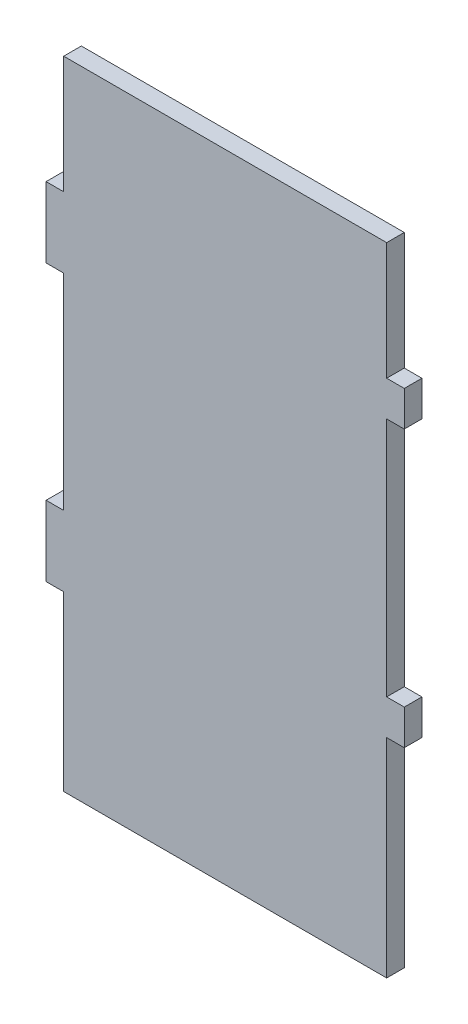
ISO-10303-21;
HEADER;
FILE_DESCRIPTION(('STEP AP214'),'2;1');
FILE_NAME('part.step','',(''),(''),'','','');
FILE_SCHEMA(('AUTOMOTIVE_DESIGN { 1 0 10303 214 1 1 1 1 }'));
ENDSEC;
DATA;
#1=APPLICATION_CONTEXT('core data for automotive mechanical design processes');
#2=APPLICATION_PROTOCOL_DEFINITION('international standard','automotive_design',2000,#1);
#3=PRODUCT_CONTEXT('',#1,'mechanical');
#4=PRODUCT('Part','Part','',(#3));
#5=PRODUCT_RELATED_PRODUCT_CATEGORY('part','',(#4));
#6=PRODUCT_DEFINITION_FORMATION('','',#4);
#7=PRODUCT_DEFINITION_CONTEXT('part definition',#1,'design');
#8=PRODUCT_DEFINITION('design','',#6,#7);
#9=PRODUCT_DEFINITION_SHAPE('','',#8);
#10=(LENGTH_UNIT() NAMED_UNIT(*) SI_UNIT(.MILLI.,.METRE.));
#11=(NAMED_UNIT(*) PLANE_ANGLE_UNIT() SI_UNIT($,.RADIAN.));
#12=(NAMED_UNIT(*) SI_UNIT($,.STERADIAN.) SOLID_ANGLE_UNIT());
#13=UNCERTAINTY_MEASURE_WITH_UNIT(LENGTH_MEASURE(1.E-05),#10,'distance_accuracy_value','');
#14=(GEOMETRIC_REPRESENTATION_CONTEXT(3) GLOBAL_UNCERTAINTY_ASSIGNED_CONTEXT((#13)) GLOBAL_UNIT_ASSIGNED_CONTEXT((#10,
#11,#12)) REPRESENTATION_CONTEXT('',''));
#15=CARTESIAN_POINT('',(0.,0.,0.));
#16=DIRECTION('',(0.,0.,1.));
#17=DIRECTION('',(1.,0.,0.));
#18=AXIS2_PLACEMENT_3D('',#15,#16,#17);
#19=CARTESIAN_POINT('',(0.,-20.,3.));
#20=DIRECTION('',(0.,-1.,0.));
#21=DIRECTION('',(0.,0.,-1.));
#22=AXIS2_PLACEMENT_3D('',#19,#20,#21);
#23=PLANE('',#22);
#24=DIRECTION('',(-1.,0.,0.));
#25=VECTOR('',#24,1.);
#26=CARTESIAN_POINT('',(0.,-20.,0.));
#27=LINE('',#26,#25);
#28=CARTESIAN_POINT('',(0.,-20.,0.));
#29=VERTEX_POINT('',#28);
#30=CARTESIAN_POINT('',(-3.,-20.,0.));
#31=VERTEX_POINT('',#30);
#32=EDGE_CURVE('E207',#29,#31,#27,.T.);
#33=ORIENTED_EDGE('',*,*,#32,.T.);
#34=DIRECTION('',(0.,0.,-1.));
#35=VECTOR('',#34,1.);
#36=CARTESIAN_POINT('',(-3.,-20.,3.));
#37=LINE('',#36,#35);
#38=CARTESIAN_POINT('',(-3.,-20.,3.));
#39=VERTEX_POINT('',#38);
#40=EDGE_CURVE('E11',#39,#31,#37,.T.);
#41=ORIENTED_EDGE('',*,*,#40,.F.);
#42=DIRECTION('',(-1.,0.,0.));
#43=VECTOR('',#42,1.);
#44=CARTESIAN_POINT('',(0.,-20.,3.));
#45=LINE('',#44,#43);
#46=CARTESIAN_POINT('',(0.,-20.,3.));
#47=VERTEX_POINT('',#46);
#48=EDGE_CURVE('E245',#47,#39,#45,.T.);
#49=ORIENTED_EDGE('',*,*,#48,.F.);
#50=DIRECTION('',(0.,0.,-1.));
#51=VECTOR('',#50,1.);
#52=CARTESIAN_POINT('',(0.,-20.,3.));
#53=LINE('',#52,#51);
#54=EDGE_CURVE('E203',#47,#29,#53,.T.);
#55=ORIENTED_EDGE('',*,*,#54,.T.);
#56=EDGE_LOOP('',(#33,#41,#49,#55));
#57=FACE_BOUND('',#56,.T.);
#58=ADVANCED_FACE('F39',(#57),#23,.F.);
#59=CARTESIAN_POINT('',(-3.,-20.,3.));
#60=DIRECTION('',(1.,0.,0.));
#61=DIRECTION('',(0.,1.,0.));
#62=AXIS2_PLACEMENT_3D('',#59,#60,#61);
#63=PLANE('',#62);
#64=DIRECTION('',(0.,-1.,0.));
#65=VECTOR('',#64,1.);
#66=CARTESIAN_POINT('',(-3.,-20.,0.));
#67=LINE('',#66,#65);
#68=CARTESIAN_POINT('',(-3.,-32.,0.));
#69=VERTEX_POINT('',#68);
#70=EDGE_CURVE('E210',#31,#69,#67,.T.);
#71=ORIENTED_EDGE('',*,*,#70,.T.);
#72=DIRECTION('',(0.,0.,-1.));
#73=VECTOR('',#72,1.);
#74=CARTESIAN_POINT('',(-3.,-32.,3.));
#75=LINE('',#74,#73);
#76=CARTESIAN_POINT('',(-3.,-32.,3.));
#77=VERTEX_POINT('',#76);
#78=EDGE_CURVE('E47',#77,#69,#75,.T.);
#79=ORIENTED_EDGE('',*,*,#78,.F.);
#80=DIRECTION('',(0.,-1.,0.));
#81=VECTOR('',#80,1.);
#82=CARTESIAN_POINT('',(-3.,-20.,3.));
#83=LINE('',#82,#81);
#84=EDGE_CURVE('E134',#39,#77,#83,.T.);
#85=ORIENTED_EDGE('',*,*,#84,.F.);
#86=ORIENTED_EDGE('',*,*,#40,.T.);
#87=EDGE_LOOP('',(#71,#79,#85,#86));
#88=FACE_BOUND('',#87,.T.);
#89=ADVANCED_FACE('F363',(#88),#63,.F.);
#90=CARTESIAN_POINT('',(0.,-32.,3.));
#91=DIRECTION('',(0.,1.,0.));
#92=DIRECTION('',(0.,0.,1.));
#93=AXIS2_PLACEMENT_3D('',#90,#91,#92);
#94=PLANE('',#93);
#95=DIRECTION('',(1.,0.,0.));
#96=VECTOR('',#95,1.);
#97=CARTESIAN_POINT('',(0.,-32.,0.));
#98=LINE('',#97,#96);
#99=CARTESIAN_POINT('',(0.,-32.,0.));
#100=VERTEX_POINT('',#99);
#101=EDGE_CURVE('E212',#69,#100,#98,.T.);
#102=ORIENTED_EDGE('',*,*,#101,.T.);
#103=DIRECTION('',(0.,0.,-1.));
#104=VECTOR('',#103,1.);
#105=CARTESIAN_POINT('',(0.,-32.,3.));
#106=LINE('',#105,#104);
#107=CARTESIAN_POINT('',(0.,-32.,3.));
#108=VERTEX_POINT('',#107);
#109=EDGE_CURVE('E288',#108,#100,#106,.T.);
#110=ORIENTED_EDGE('',*,*,#109,.F.);
#111=DIRECTION('',(1.,0.,0.));
#112=VECTOR('',#111,1.);
#113=CARTESIAN_POINT('',(0.,-32.,3.));
#114=LINE('',#113,#112);
#115=EDGE_CURVE('E296',#77,#108,#114,.T.);
#116=ORIENTED_EDGE('',*,*,#115,.F.);
#117=ORIENTED_EDGE('',*,*,#78,.T.);
#118=EDGE_LOOP('',(#102,#110,#116,#117));
#119=FACE_BOUND('',#118,.T.);
#120=ADVANCED_FACE('F294',(#119),#94,.F.);
#121=CARTESIAN_POINT('',(0.,-32.,3.));
#122=DIRECTION('',(1.,0.,0.));
#123=DIRECTION('',(0.,1.,0.));
#124=AXIS2_PLACEMENT_3D('',#121,#122,#123);
#125=PLANE('',#124);
#126=DIRECTION('',(0.,-1.,0.));
#127=VECTOR('',#126,1.);
#128=CARTESIAN_POINT('',(0.,-32.,0.));
#129=LINE('',#128,#127);
#130=CARTESIAN_POINT('',(0.,-67.,0.));
#131=VERTEX_POINT('',#130);
#132=EDGE_CURVE('E214',#100,#131,#129,.T.);
#133=ORIENTED_EDGE('',*,*,#132,.T.);
#134=DIRECTION('',(0.,0.,-1.));
#135=VECTOR('',#134,1.);
#136=CARTESIAN_POINT('',(0.,-67.,3.));
#137=LINE('',#136,#135);
#138=CARTESIAN_POINT('',(0.,-67.,3.));
#139=VERTEX_POINT('',#138);
#140=EDGE_CURVE('E285',#139,#131,#137,.T.);
#141=ORIENTED_EDGE('',*,*,#140,.F.);
#142=DIRECTION('',(0.,-1.,0.));
#143=VECTOR('',#142,1.);
#144=CARTESIAN_POINT('',(0.,-32.,3.));
#145=LINE('',#144,#143);
#146=EDGE_CURVE('E314',#108,#139,#145,.T.);
#147=ORIENTED_EDGE('',*,*,#146,.F.);
#148=ORIENTED_EDGE('',*,*,#109,.T.);
#149=EDGE_LOOP('',(#133,#141,#147,#148));
#150=FACE_BOUND('',#149,.T.);
#151=ADVANCED_FACE('F305',(#150),#125,.F.);
#152=CARTESIAN_POINT('',(0.,-67.,3.));
#153=DIRECTION('',(0.,-1.,0.));
#154=DIRECTION('',(0.,0.,-1.));
#155=AXIS2_PLACEMENT_3D('',#152,#153,#154);
#156=PLANE('',#155);
#157=DIRECTION('',(-1.,0.,0.));
#158=VECTOR('',#157,1.);
#159=CARTESIAN_POINT('',(0.,-67.,0.));
#160=LINE('',#159,#158);
#161=CARTESIAN_POINT('',(-3.,-67.,0.));
#162=VERTEX_POINT('',#161);
#163=EDGE_CURVE('E216',#131,#162,#160,.T.);
#164=ORIENTED_EDGE('',*,*,#163,.T.);
#165=DIRECTION('',(0.,0.,-1.));
#166=VECTOR('',#165,1.);
#167=CARTESIAN_POINT('',(-3.,-67.,3.));
#168=LINE('',#167,#166);
#169=CARTESIAN_POINT('',(-3.,-67.,3.));
#170=VERTEX_POINT('',#169);
#171=EDGE_CURVE('E282',#170,#162,#168,.T.);
#172=ORIENTED_EDGE('',*,*,#171,.F.);
#173=DIRECTION('',(-1.,0.,0.));
#174=VECTOR('',#173,1.);
#175=CARTESIAN_POINT('',(0.,-67.,3.));
#176=LINE('',#175,#174);
#177=EDGE_CURVE('E311',#139,#170,#176,.T.);
#178=ORIENTED_EDGE('',*,*,#177,.F.);
#179=ORIENTED_EDGE('',*,*,#140,.T.);
#180=EDGE_LOOP('',(#164,#172,#178,#179));
#181=FACE_BOUND('',#180,.T.);
#182=ADVANCED_FACE('F309',(#181),#156,.F.);
#183=CARTESIAN_POINT('',(-3.,-67.,3.));
#184=DIRECTION('',(1.,0.,0.));
#185=DIRECTION('',(0.,1.,0.));
#186=AXIS2_PLACEMENT_3D('',#183,#184,#185);
#187=PLANE('',#186);
#188=DIRECTION('',(0.,-1.,0.));
#189=VECTOR('',#188,1.);
#190=CARTESIAN_POINT('',(-3.,-67.,0.));
#191=LINE('',#190,#189);
#192=CARTESIAN_POINT('',(-2.99999999999999,-79.,0.));
#193=VERTEX_POINT('',#192);
#194=EDGE_CURVE('E218',#162,#193,#191,.T.);
#195=ORIENTED_EDGE('',*,*,#194,.T.);
#196=DIRECTION('',(0.,0.,-1.));
#197=VECTOR('',#196,1.);
#198=CARTESIAN_POINT('',(-2.99999999999999,-79.,3.));
#199=LINE('',#198,#197);
#200=CARTESIAN_POINT('',(-2.99999999999999,-79.,3.));
#201=VERTEX_POINT('',#200);
#202=EDGE_CURVE('E279',#201,#193,#199,.T.);
#203=ORIENTED_EDGE('',*,*,#202,.F.);
#204=DIRECTION('',(0.,-1.,0.));
#205=VECTOR('',#204,1.);
#206=CARTESIAN_POINT('',(-3.,-67.,3.));
#207=LINE('',#206,#205);
#208=EDGE_CURVE('E313',#170,#201,#207,.T.);
#209=ORIENTED_EDGE('',*,*,#208,.F.);
#210=ORIENTED_EDGE('',*,*,#171,.T.);
#211=EDGE_LOOP('',(#195,#203,#209,#210));
#212=FACE_BOUND('',#211,.T.);
#213=ADVANCED_FACE('F376',(#212),#187,.F.);
#214=CARTESIAN_POINT('',(0.,-79.,3.));
#215=DIRECTION('',(0.,1.,0.));
#216=DIRECTION('',(0.,0.,1.));
#217=AXIS2_PLACEMENT_3D('',#214,#215,#216);
#218=PLANE('',#217);
#219=DIRECTION('',(1.,0.,0.));
#220=VECTOR('',#219,1.);
#221=CARTESIAN_POINT('',(0.,-79.,0.));
#222=LINE('',#221,#220);
#223=CARTESIAN_POINT('',(0.,-79.,0.));
#224=VERTEX_POINT('',#223);
#225=EDGE_CURVE('E220',#193,#224,#222,.T.);
#226=ORIENTED_EDGE('',*,*,#225,.T.);
#227=DIRECTION('',(0.,0.,-1.));
#228=VECTOR('',#227,1.);
#229=CARTESIAN_POINT('',(0.,-79.,3.));
#230=LINE('',#229,#228);
#231=CARTESIAN_POINT('',(0.,-79.,3.));
#232=VERTEX_POINT('',#231);
#233=EDGE_CURVE('E276',#232,#224,#230,.T.);
#234=ORIENTED_EDGE('',*,*,#233,.F.);
#235=DIRECTION('',(1.,0.,0.));
#236=VECTOR('',#235,1.);
#237=CARTESIAN_POINT('',(0.,-79.,3.));
#238=LINE('',#237,#236);
#239=EDGE_CURVE('E316',#201,#232,#238,.T.);
#240=ORIENTED_EDGE('',*,*,#239,.F.);
#241=ORIENTED_EDGE('',*,*,#202,.T.);
#242=EDGE_LOOP('',(#226,#234,#240,#241));
#243=FACE_BOUND('',#242,.T.);
#244=ADVANCED_FACE('F379',(#243),#218,.F.);
#245=CARTESIAN_POINT('',(0.,-79.,3.));
#246=DIRECTION('',(1.,0.,0.));
#247=DIRECTION('',(0.,1.,0.));
#248=AXIS2_PLACEMENT_3D('',#245,#246,#247);
#249=PLANE('',#248);
#250=DIRECTION('',(0.,-1.,0.));
#251=VECTOR('',#250,1.);
#252=CARTESIAN_POINT('',(0.,-79.,0.));
#253=LINE('',#252,#251);
#254=CARTESIAN_POINT('',(0.,-108.46,0.));
#255=VERTEX_POINT('',#254);
#256=EDGE_CURVE('E222',#224,#255,#253,.T.);
#257=ORIENTED_EDGE('',*,*,#256,.T.);
#258=DIRECTION('',(0.,0.,-1.));
#259=VECTOR('',#258,1.);
#260=CARTESIAN_POINT('',(0.,-108.46,3.));
#261=LINE('',#260,#259);
#262=CARTESIAN_POINT('',(0.,-108.46,3.));
#263=VERTEX_POINT('',#262);
#264=EDGE_CURVE('E273',#263,#255,#261,.T.);
#265=ORIENTED_EDGE('',*,*,#264,.F.);
#266=DIRECTION('',(0.,-1.,0.));
#267=VECTOR('',#266,1.);
#268=CARTESIAN_POINT('',(0.,-79.,3.));
#269=LINE('',#268,#267);
#270=EDGE_CURVE('E322',#232,#263,#269,.T.);
#271=ORIENTED_EDGE('',*,*,#270,.F.);
#272=ORIENTED_EDGE('',*,*,#233,.T.);
#273=EDGE_LOOP('',(#257,#265,#271,#272));
#274=FACE_BOUND('',#273,.T.);
#275=ADVANCED_FACE('F383',(#274),#249,.F.);
#276=CARTESIAN_POINT('',(0.,-108.46,3.));
#277=DIRECTION('',(0.,1.,0.));
#278=DIRECTION('',(0.,0.,1.));
#279=AXIS2_PLACEMENT_3D('',#276,#277,#278);
#280=PLANE('',#279);
#281=DIRECTION('',(1.,0.,0.));
#282=VECTOR('',#281,1.);
#283=CARTESIAN_POINT('',(0.,-108.46,0.));
#284=LINE('',#283,#282);
#285=CARTESIAN_POINT('',(55.,-108.46,0.));
#286=VERTEX_POINT('',#285);
#287=EDGE_CURVE('E224',#255,#286,#284,.T.);
#288=ORIENTED_EDGE('',*,*,#287,.T.);
#289=DIRECTION('',(0.,0.,-1.));
#290=VECTOR('',#289,1.);
#291=CARTESIAN_POINT('',(55.,-108.46,3.));
#292=LINE('',#291,#290);
#293=CARTESIAN_POINT('',(55.,-108.46,3.));
#294=VERTEX_POINT('',#293);
#295=EDGE_CURVE('E270',#294,#286,#292,.T.);
#296=ORIENTED_EDGE('',*,*,#295,.F.);
#297=DIRECTION('',(1.,0.,0.));
#298=VECTOR('',#297,1.);
#299=CARTESIAN_POINT('',(0.,-108.46,3.));
#300=LINE('',#299,#298);
#301=EDGE_CURVE('E324',#263,#294,#300,.T.);
#302=ORIENTED_EDGE('',*,*,#301,.F.);
#303=ORIENTED_EDGE('',*,*,#264,.T.);
#304=EDGE_LOOP('',(#288,#296,#302,#303));
#305=FACE_BOUND('',#304,.T.);
#306=ADVANCED_FACE('F387',(#305),#280,.F.);
#307=CARTESIAN_POINT('',(55.,-73.,3.));
#308=DIRECTION('',(-1.,0.,0.));
#309=DIRECTION('',(0.,-1.,0.));
#310=AXIS2_PLACEMENT_3D('',#307,#308,#309);
#311=PLANE('',#310);
#312=DIRECTION('',(0.,1.,0.));
#313=VECTOR('',#312,1.);
#314=CARTESIAN_POINT('',(55.,-73.,0.));
#315=LINE('',#314,#313);
#316=CARTESIAN_POINT('',(55.,-73.,0.));
#317=VERTEX_POINT('',#316);
#318=EDGE_CURVE('E226',#286,#317,#315,.T.);
#319=ORIENTED_EDGE('',*,*,#318,.T.);
#320=DIRECTION('',(0.,0.,-1.));
#321=VECTOR('',#320,1.);
#322=CARTESIAN_POINT('',(55.,-73.,3.));
#323=LINE('',#322,#321);
#324=CARTESIAN_POINT('',(55.,-73.,3.));
#325=VERTEX_POINT('',#324);
#326=EDGE_CURVE('E267',#325,#317,#323,.T.);
#327=ORIENTED_EDGE('',*,*,#326,.F.);
#328=DIRECTION('',(0.,1.,0.));
#329=VECTOR('',#328,1.);
#330=CARTESIAN_POINT('',(55.,-73.,3.));
#331=LINE('',#330,#329);
#332=EDGE_CURVE('E326',#294,#325,#331,.T.);
#333=ORIENTED_EDGE('',*,*,#332,.F.);
#334=ORIENTED_EDGE('',*,*,#295,.T.);
#335=EDGE_LOOP('',(#319,#327,#333,#334));
#336=FACE_BOUND('',#335,.T.);
#337=ADVANCED_FACE('F391',(#336),#311,.F.);
#338=CARTESIAN_POINT('',(55.,-73.,3.));
#339=DIRECTION('',(0.,1.,0.));
#340=DIRECTION('',(0.,0.,1.));
#341=AXIS2_PLACEMENT_3D('',#338,#339,#340);
#342=PLANE('',#341);
#343=DIRECTION('',(1.,0.,0.));
#344=VECTOR('',#343,1.);
#345=CARTESIAN_POINT('',(55.,-73.,0.));
#346=LINE('',#345,#344);
#347=CARTESIAN_POINT('',(58.,-73.,0.));
#348=VERTEX_POINT('',#347);
#349=EDGE_CURVE('E228',#317,#348,#346,.T.);
#350=ORIENTED_EDGE('',*,*,#349,.T.);
#351=DIRECTION('',(0.,0.,-1.));
#352=VECTOR('',#351,1.);
#353=CARTESIAN_POINT('',(58.,-73.,3.));
#354=LINE('',#353,#352);
#355=CARTESIAN_POINT('',(58.,-73.,3.));
#356=VERTEX_POINT('',#355);
#357=EDGE_CURVE('E264',#356,#348,#354,.T.);
#358=ORIENTED_EDGE('',*,*,#357,.F.);
#359=DIRECTION('',(1.,0.,0.));
#360=VECTOR('',#359,1.);
#361=CARTESIAN_POINT('',(55.,-73.,3.));
#362=LINE('',#361,#360);
#363=EDGE_CURVE('E328',#325,#356,#362,.T.);
#364=ORIENTED_EDGE('',*,*,#363,.F.);
#365=ORIENTED_EDGE('',*,*,#326,.T.);
#366=EDGE_LOOP('',(#350,#358,#364,#365));
#367=FACE_BOUND('',#366,.T.);
#368=ADVANCED_FACE('F395',(#367),#342,.F.);
#369=CARTESIAN_POINT('',(58.,-67.,3.));
#370=DIRECTION('',(-1.,0.,0.));
#371=DIRECTION('',(0.,0.,1.));
#372=AXIS2_PLACEMENT_3D('',#369,#370,#371);
#373=PLANE('',#372);
#374=DIRECTION('',(0.,1.,0.));
#375=VECTOR('',#374,1.);
#376=CARTESIAN_POINT('',(58.,-67.,0.));
#377=LINE('',#376,#375);
#378=CARTESIAN_POINT('',(58.,-67.,0.));
#379=VERTEX_POINT('',#378);
#380=EDGE_CURVE('E230',#348,#379,#377,.T.);
#381=ORIENTED_EDGE('',*,*,#380,.T.);
#382=DIRECTION('',(0.,0.,-1.));
#383=VECTOR('',#382,1.);
#384=CARTESIAN_POINT('',(58.,-67.,3.));
#385=LINE('',#384,#383);
#386=CARTESIAN_POINT('',(58.,-67.,3.));
#387=VERTEX_POINT('',#386);
#388=EDGE_CURVE('E261',#387,#379,#385,.T.);
#389=ORIENTED_EDGE('',*,*,#388,.F.);
#390=DIRECTION('',(0.,1.,0.));
#391=VECTOR('',#390,1.);
#392=CARTESIAN_POINT('',(58.,-67.,3.));
#393=LINE('',#392,#391);
#394=EDGE_CURVE('E330',#356,#387,#393,.T.);
#395=ORIENTED_EDGE('',*,*,#394,.F.);
#396=ORIENTED_EDGE('',*,*,#357,.T.);
#397=EDGE_LOOP('',(#381,#389,#395,#396));
#398=FACE_BOUND('',#397,.T.);
#399=ADVANCED_FACE('F399',(#398),#373,.F.);
#400=CARTESIAN_POINT('',(55.,-67.,3.));
#401=DIRECTION('',(0.,-1.,0.));
#402=DIRECTION('',(0.,0.,-1.));
#403=AXIS2_PLACEMENT_3D('',#400,#401,#402);
#404=PLANE('',#403);
#405=DIRECTION('',(-1.,0.,0.));
#406=VECTOR('',#405,1.);
#407=CARTESIAN_POINT('',(55.,-67.,0.));
#408=LINE('',#407,#406);
#409=CARTESIAN_POINT('',(55.,-67.,0.));
#410=VERTEX_POINT('',#409);
#411=EDGE_CURVE('E232',#379,#410,#408,.T.);
#412=ORIENTED_EDGE('',*,*,#411,.T.);
#413=DIRECTION('',(0.,0.,-1.));
#414=VECTOR('',#413,1.);
#415=CARTESIAN_POINT('',(55.,-67.,3.));
#416=LINE('',#415,#414);
#417=CARTESIAN_POINT('',(55.,-67.,3.));
#418=VERTEX_POINT('',#417);
#419=EDGE_CURVE('E258',#418,#410,#416,.T.);
#420=ORIENTED_EDGE('',*,*,#419,.F.);
#421=DIRECTION('',(-1.,0.,0.));
#422=VECTOR('',#421,1.);
#423=CARTESIAN_POINT('',(55.,-67.,3.));
#424=LINE('',#423,#422);
#425=EDGE_CURVE('E332',#387,#418,#424,.T.);
#426=ORIENTED_EDGE('',*,*,#425,.F.);
#427=ORIENTED_EDGE('',*,*,#388,.T.);
#428=EDGE_LOOP('',(#412,#420,#426,#427));
#429=FACE_BOUND('',#428,.T.);
#430=ADVANCED_FACE('F403',(#429),#404,.F.);
#431=CARTESIAN_POINT('',(55.,-26.,3.));
#432=DIRECTION('',(-1.,0.,0.));
#433=DIRECTION('',(0.,-1.,0.));
#434=AXIS2_PLACEMENT_3D('',#431,#432,#433);
#435=PLANE('',#434);
#436=DIRECTION('',(0.,1.,0.));
#437=VECTOR('',#436,1.);
#438=CARTESIAN_POINT('',(55.,-26.,0.));
#439=LINE('',#438,#437);
#440=CARTESIAN_POINT('',(55.,-26.,0.));
#441=VERTEX_POINT('',#440);
#442=EDGE_CURVE('E234',#410,#441,#439,.T.);
#443=ORIENTED_EDGE('',*,*,#442,.T.);
#444=DIRECTION('',(0.,0.,-1.));
#445=VECTOR('',#444,1.);
#446=CARTESIAN_POINT('',(55.,-26.,3.));
#447=LINE('',#446,#445);
#448=CARTESIAN_POINT('',(55.,-26.,3.));
#449=VERTEX_POINT('',#448);
#450=EDGE_CURVE('E255',#449,#441,#447,.T.);
#451=ORIENTED_EDGE('',*,*,#450,.F.);
#452=DIRECTION('',(0.,1.,0.));
#453=VECTOR('',#452,1.);
#454=CARTESIAN_POINT('',(55.,-26.,3.));
#455=LINE('',#454,#453);
#456=EDGE_CURVE('E334',#418,#449,#455,.T.);
#457=ORIENTED_EDGE('',*,*,#456,.F.);
#458=ORIENTED_EDGE('',*,*,#419,.T.);
#459=EDGE_LOOP('',(#443,#451,#457,#458));
#460=FACE_BOUND('',#459,.T.);
#461=ADVANCED_FACE('F407',(#460),#435,.F.);
#462=CARTESIAN_POINT('',(55.,-26.,3.));
#463=DIRECTION('',(0.,1.,0.));
#464=DIRECTION('',(-1.,0.,0.));
#465=AXIS2_PLACEMENT_3D('',#462,#463,#464);
#466=PLANE('',#465);
#467=DIRECTION('',(1.,0.,0.));
#468=VECTOR('',#467,1.);
#469=CARTESIAN_POINT('',(55.,-26.,0.));
#470=LINE('',#469,#468);
#471=CARTESIAN_POINT('',(58.,-26.,0.));
#472=VERTEX_POINT('',#471);
#473=EDGE_CURVE('E236',#441,#472,#470,.T.);
#474=ORIENTED_EDGE('',*,*,#473,.T.);
#475=DIRECTION('',(0.,0.,-1.));
#476=VECTOR('',#475,1.);
#477=CARTESIAN_POINT('',(58.,-26.,3.));
#478=LINE('',#477,#476);
#479=CARTESIAN_POINT('',(58.,-26.,3.));
#480=VERTEX_POINT('',#479);
#481=EDGE_CURVE('E252',#480,#472,#478,.T.);
#482=ORIENTED_EDGE('',*,*,#481,.F.);
#483=DIRECTION('',(1.,0.,0.));
#484=VECTOR('',#483,1.);
#485=CARTESIAN_POINT('',(55.,-26.,3.));
#486=LINE('',#485,#484);
#487=EDGE_CURVE('E336',#449,#480,#486,.T.);
#488=ORIENTED_EDGE('',*,*,#487,.F.);
#489=ORIENTED_EDGE('',*,*,#450,.T.);
#490=EDGE_LOOP('',(#474,#482,#488,#489));
#491=FACE_BOUND('',#490,.T.);
#492=ADVANCED_FACE('F411',(#491),#466,.F.);
#493=CARTESIAN_POINT('',(58.,-20.,3.));
#494=DIRECTION('',(-1.,0.,0.));
#495=DIRECTION('',(0.,0.,1.));
#496=AXIS2_PLACEMENT_3D('',#493,#494,#495);
#497=PLANE('',#496);
#498=DIRECTION('',(0.,1.,0.));
#499=VECTOR('',#498,1.);
#500=CARTESIAN_POINT('',(58.,-20.,0.));
#501=LINE('',#500,#499);
#502=CARTESIAN_POINT('',(58.,-20.,0.));
#503=VERTEX_POINT('',#502);
#504=EDGE_CURVE('E238',#472,#503,#501,.T.);
#505=ORIENTED_EDGE('',*,*,#504,.T.);
#506=DIRECTION('',(0.,0.,-1.));
#507=VECTOR('',#506,1.);
#508=CARTESIAN_POINT('',(58.,-20.,3.));
#509=LINE('',#508,#507);
#510=CARTESIAN_POINT('',(58.,-20.,3.));
#511=VERTEX_POINT('',#510);
#512=EDGE_CURVE('E249',#511,#503,#509,.T.);
#513=ORIENTED_EDGE('',*,*,#512,.F.);
#514=DIRECTION('',(0.,1.,0.));
#515=VECTOR('',#514,1.);
#516=CARTESIAN_POINT('',(58.,-20.,3.));
#517=LINE('',#516,#515);
#518=EDGE_CURVE('E338',#480,#511,#517,.T.);
#519=ORIENTED_EDGE('',*,*,#518,.F.);
#520=ORIENTED_EDGE('',*,*,#481,.T.);
#521=EDGE_LOOP('',(#505,#513,#519,#520));
#522=FACE_BOUND('',#521,.T.);
#523=ADVANCED_FACE('F344',(#522),#497,.F.);
#524=CARTESIAN_POINT('',(55.,-20.,3.));
#525=DIRECTION('',(0.,-1.,0.));
#526=DIRECTION('',(0.,0.,-1.));
#527=AXIS2_PLACEMENT_3D('',#524,#525,#526);
#528=PLANE('',#527);
#529=DIRECTION('',(-1.,0.,0.));
#530=VECTOR('',#529,1.);
#531=CARTESIAN_POINT('',(55.,-20.,0.));
#532=LINE('',#531,#530);
#533=CARTESIAN_POINT('',(55.,-20.,0.));
#534=VERTEX_POINT('',#533);
#535=EDGE_CURVE('E240',#503,#534,#532,.T.);
#536=ORIENTED_EDGE('',*,*,#535,.T.);
#537=DIRECTION('',(0.,0.,-1.));
#538=VECTOR('',#537,1.);
#539=CARTESIAN_POINT('',(55.,-20.,3.));
#540=LINE('',#539,#538);
#541=CARTESIAN_POINT('',(55.,-20.,3.));
#542=VERTEX_POINT('',#541);
#543=EDGE_CURVE('E198',#542,#534,#540,.T.);
#544=ORIENTED_EDGE('',*,*,#543,.F.);
#545=DIRECTION('',(-1.,0.,0.));
#546=VECTOR('',#545,1.);
#547=CARTESIAN_POINT('',(55.,-20.,3.));
#548=LINE('',#547,#546);
#549=EDGE_CURVE('E189',#511,#542,#548,.T.);
#550=ORIENTED_EDGE('',*,*,#549,.F.);
#551=ORIENTED_EDGE('',*,*,#512,.T.);
#552=EDGE_LOOP('',(#536,#544,#550,#551));
#553=FACE_BOUND('',#552,.T.);
#554=ADVANCED_FACE('F348',(#553),#528,.F.);
#555=CARTESIAN_POINT('',(55.,0.,3.));
#556=DIRECTION('',(-1.,0.,0.));
#557=DIRECTION('',(0.,0.,1.));
#558=AXIS2_PLACEMENT_3D('',#555,#556,#557);
#559=PLANE('',#558);
#560=DIRECTION('',(0.,1.,0.));
#561=VECTOR('',#560,1.);
#562=CARTESIAN_POINT('',(55.,0.,0.));
#563=LINE('',#562,#561);
#564=CARTESIAN_POINT('',(55.,0.,0.));
#565=VERTEX_POINT('',#564);
#566=EDGE_CURVE('E197',#534,#565,#563,.T.);
#567=ORIENTED_EDGE('',*,*,#566,.T.);
#568=DIRECTION('',(0.,0.,-1.));
#569=VECTOR('',#568,1.);
#570=CARTESIAN_POINT('',(55.,0.,3.));
#571=LINE('',#570,#569);
#572=CARTESIAN_POINT('',(55.,0.,3.));
#573=VERTEX_POINT('',#572);
#574=EDGE_CURVE('E194',#573,#565,#571,.T.);
#575=ORIENTED_EDGE('',*,*,#574,.F.);
#576=DIRECTION('',(0.,1.,0.));
#577=VECTOR('',#576,1.);
#578=CARTESIAN_POINT('',(55.,0.,3.));
#579=LINE('',#578,#577);
#580=EDGE_CURVE('E183',#542,#573,#579,.T.);
#581=ORIENTED_EDGE('',*,*,#580,.F.);
#582=ORIENTED_EDGE('',*,*,#543,.T.);
#583=EDGE_LOOP('',(#567,#575,#581,#582));
#584=FACE_BOUND('',#583,.T.);
#585=ADVANCED_FACE('F195',(#584),#559,.F.);
#586=CARTESIAN_POINT('',(0.,0.,3.));
#587=DIRECTION('',(0.,-1.,0.));
#588=DIRECTION('',(0.,0.,-1.));
#589=AXIS2_PLACEMENT_3D('',#586,#587,#588);
#590=PLANE('',#589);
#591=DIRECTION('',(-1.,0.,0.));
#592=VECTOR('',#591,1.);
#593=CARTESIAN_POINT('',(0.,0.,0.));
#594=LINE('',#593,#592);
#595=CARTESIAN_POINT('',(0.,0.,0.));
#596=VERTEX_POINT('',#595);
#597=EDGE_CURVE('E120',#565,#596,#594,.T.);
#598=ORIENTED_EDGE('',*,*,#597,.T.);
#599=DIRECTION('',(0.,0.,-1.));
#600=VECTOR('',#599,1.);
#601=CARTESIAN_POINT('',(0.,0.,3.));
#602=LINE('',#601,#600);
#603=CARTESIAN_POINT('',(0.,0.,3.));
#604=VERTEX_POINT('',#603);
#605=EDGE_CURVE('E199',#604,#596,#602,.T.);
#606=ORIENTED_EDGE('',*,*,#605,.F.);
#607=DIRECTION('',(-1.,0.,0.));
#608=VECTOR('',#607,1.);
#609=CARTESIAN_POINT('',(0.,0.,3.));
#610=LINE('',#609,#608);
#611=EDGE_CURVE('E187',#573,#604,#610,.T.);
#612=ORIENTED_EDGE('',*,*,#611,.F.);
#613=ORIENTED_EDGE('',*,*,#574,.T.);
#614=EDGE_LOOP('',(#598,#606,#612,#613));
#615=FACE_BOUND('',#614,.T.);
#616=ADVANCED_FACE('F201',(#615),#590,.F.);
#617=CARTESIAN_POINT('',(0.,0.,3.));
#618=DIRECTION('',(1.,0.,0.));
#619=DIRECTION('',(0.,1.,0.));
#620=AXIS2_PLACEMENT_3D('',#617,#618,#619);
#621=PLANE('',#620);
#622=DIRECTION('',(0.,-1.,0.));
#623=VECTOR('',#622,1.);
#624=CARTESIAN_POINT('',(0.,0.,0.));
#625=LINE('',#624,#623);
#626=EDGE_CURVE('E126',#596,#29,#625,.T.);
#627=ORIENTED_EDGE('',*,*,#626,.T.);
#628=ORIENTED_EDGE('',*,*,#54,.F.);
#629=DIRECTION('',(0.,-1.,0.));
#630=VECTOR('',#629,1.);
#631=CARTESIAN_POINT('',(0.,0.,3.));
#632=LINE('',#631,#630);
#633=EDGE_CURVE('E55',#604,#47,#632,.T.);
#634=ORIENTED_EDGE('',*,*,#633,.F.);
#635=ORIENTED_EDGE('',*,*,#605,.T.);
#636=EDGE_LOOP('',(#627,#628,#634,#635));
#637=FACE_BOUND('',#636,.T.);
#638=ADVANCED_FACE('F352',(#637),#621,.F.);
#639=CARTESIAN_POINT('',(0.,0.,3.));
#640=DIRECTION('',(0.,0.,1.));
#641=DIRECTION('',(1.,0.,0.));
#642=AXIS2_PLACEMENT_3D('',#639,#640,#641);
#643=PLANE('',#642);
#644=ORIENTED_EDGE('',*,*,#48,.T.);
#645=ORIENTED_EDGE('',*,*,#84,.T.);
#646=ORIENTED_EDGE('',*,*,#115,.T.);
#647=ORIENTED_EDGE('',*,*,#146,.T.);
#648=ORIENTED_EDGE('',*,*,#177,.T.);
#649=ORIENTED_EDGE('',*,*,#208,.T.);
#650=ORIENTED_EDGE('',*,*,#239,.T.);
#651=ORIENTED_EDGE('',*,*,#270,.T.);
#652=ORIENTED_EDGE('',*,*,#301,.T.);
#653=ORIENTED_EDGE('',*,*,#332,.T.);
#654=ORIENTED_EDGE('',*,*,#363,.T.);
#655=ORIENTED_EDGE('',*,*,#394,.T.);
#656=ORIENTED_EDGE('',*,*,#425,.T.);
#657=ORIENTED_EDGE('',*,*,#456,.T.);
#658=ORIENTED_EDGE('',*,*,#487,.T.);
#659=ORIENTED_EDGE('',*,*,#518,.T.);
#660=ORIENTED_EDGE('',*,*,#549,.T.);
#661=ORIENTED_EDGE('',*,*,#580,.T.);
#662=ORIENTED_EDGE('',*,*,#611,.T.);
#663=ORIENTED_EDGE('',*,*,#633,.T.);
#664=EDGE_LOOP('',(#644,#645,#646,#647,#648,#649,#650,#651,#652,#653,#654,#655,#656,#657,#658,
#659,#660,#661,#662,#663));
#665=FACE_BOUND('',#664,.T.);
#666=ADVANCED_FACE('F185',(#665),#643,.T.);
#667=CARTESIAN_POINT('',(0.,0.,0.));
#668=DIRECTION('',(0.,0.,1.));
#669=DIRECTION('',(1.,0.,0.));
#670=AXIS2_PLACEMENT_3D('',#667,#668,#669);
#671=PLANE('',#670);
#672=ORIENTED_EDGE('',*,*,#32,.F.);
#673=ORIENTED_EDGE('',*,*,#626,.F.);
#674=ORIENTED_EDGE('',*,*,#597,.F.);
#675=ORIENTED_EDGE('',*,*,#566,.F.);
#676=ORIENTED_EDGE('',*,*,#535,.F.);
#677=ORIENTED_EDGE('',*,*,#504,.F.);
#678=ORIENTED_EDGE('',*,*,#473,.F.);
#679=ORIENTED_EDGE('',*,*,#442,.F.);
#680=ORIENTED_EDGE('',*,*,#411,.F.);
#681=ORIENTED_EDGE('',*,*,#380,.F.);
#682=ORIENTED_EDGE('',*,*,#349,.F.);
#683=ORIENTED_EDGE('',*,*,#318,.F.);
#684=ORIENTED_EDGE('',*,*,#287,.F.);
#685=ORIENTED_EDGE('',*,*,#256,.F.);
#686=ORIENTED_EDGE('',*,*,#225,.F.);
#687=ORIENTED_EDGE('',*,*,#194,.F.);
#688=ORIENTED_EDGE('',*,*,#163,.F.);
#689=ORIENTED_EDGE('',*,*,#132,.F.);
#690=ORIENTED_EDGE('',*,*,#101,.F.);
#691=ORIENTED_EDGE('',*,*,#70,.F.);
#692=EDGE_LOOP('',(#672,#673,#674,#675,#676,#677,#678,#679,#680,#681,#682,#683,#684,#685,#686,
#687,#688,#689,#690,#691));
#693=FACE_BOUND('',#692,.T.);
#694=ADVANCED_FACE('F300',(#693),#671,.F.);
#695=CLOSED_SHELL('',(#58,#89,#120,#151,#182,#213,#244,#275,#306,#337,#368,#399,#430,#461,#492,
#523,#554,#585,#616,#638,#666,#694));
#696=MANIFOLD_SOLID_BREP('B2',#695);
#697=ADVANCED_BREP_SHAPE_REPRESENTATION('',(#18,#696),#14);
#698=SHAPE_DEFINITION_REPRESENTATION(#9,#697);
ENDSEC;
END-ISO-10303-21;
